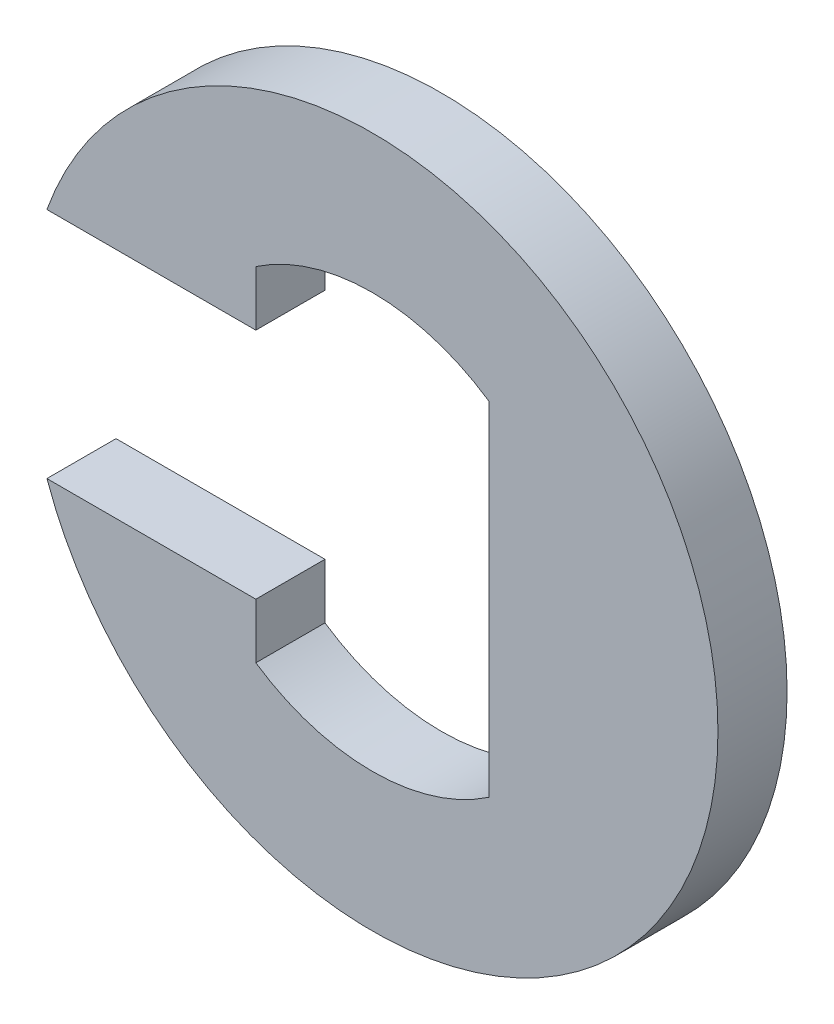
ISO-10303-21;
HEADER;
FILE_DESCRIPTION(('STEP AP214'),'2;1');
FILE_NAME('part.step','',(''),(''),'','','');
FILE_SCHEMA(('AUTOMOTIVE_DESIGN { 1 0 10303 214 1 1 1 1 }'));
ENDSEC;
DATA;
#1=APPLICATION_CONTEXT('core data for automotive mechanical design processes');
#2=APPLICATION_PROTOCOL_DEFINITION('international standard','automotive_design',2000,#1);
#3=PRODUCT_CONTEXT('',#1,'mechanical');
#4=PRODUCT('Part','Part','',(#3));
#5=PRODUCT_RELATED_PRODUCT_CATEGORY('part','',(#4));
#6=PRODUCT_DEFINITION_FORMATION('','',#4);
#7=PRODUCT_DEFINITION_CONTEXT('part definition',#1,'design');
#8=PRODUCT_DEFINITION('design','',#6,#7);
#9=PRODUCT_DEFINITION_SHAPE('','',#8);
#10=(LENGTH_UNIT() NAMED_UNIT(*) SI_UNIT(.MILLI.,.METRE.));
#11=(NAMED_UNIT(*) PLANE_ANGLE_UNIT() SI_UNIT($,.RADIAN.));
#12=(NAMED_UNIT(*) SI_UNIT($,.STERADIAN.) SOLID_ANGLE_UNIT());
#13=UNCERTAINTY_MEASURE_WITH_UNIT(LENGTH_MEASURE(1.E-05),#10,'distance_accuracy_value','');
#14=(GEOMETRIC_REPRESENTATION_CONTEXT(3) GLOBAL_UNCERTAINTY_ASSIGNED_CONTEXT((#13)) GLOBAL_UNIT_ASSIGNED_CONTEXT((#10,
#11,#12)) REPRESENTATION_CONTEXT('',''));
#15=CARTESIAN_POINT('',(0.,0.,0.));
#16=DIRECTION('',(0.,0.,1.));
#17=DIRECTION('',(1.,0.,0.));
#18=AXIS2_PLACEMENT_3D('',#15,#16,#17);
#19=CARTESIAN_POINT('',(0.,0.,1.));
#20=DIRECTION('',(0.,0.,-1.));
#21=DIRECTION('',(-1.,0.,0.));
#22=AXIS2_PLACEMENT_3D('',#19,#20,#21);
#23=CYLINDRICAL_SURFACE('',#22,10.);
#24=DIRECTION('',(0.,0.,1.));
#25=VECTOR('',#24,1.);
#26=CARTESIAN_POINT('',(-9.41504646828681,-3.37,-1.));
#27=LINE('',#26,#25);
#28=CARTESIAN_POINT('',(-9.41504646828681,-3.37,-1.));
#29=VERTEX_POINT('',#28);
#30=CARTESIAN_POINT('',(-9.41504646828681,-3.37,1.));
#31=VERTEX_POINT('',#30);
#32=EDGE_CURVE('E92',#29,#31,#27,.T.);
#33=ORIENTED_EDGE('',*,*,#32,.F.);
#34=CARTESIAN_POINT('',(0.,0.,-1.));
#35=DIRECTION('',(0.,0.,1.));
#36=DIRECTION('',(1.,0.,0.));
#37=AXIS2_PLACEMENT_3D('',#34,#35,#36);
#38=CIRCLE('',#37,10.);
#39=CARTESIAN_POINT('',(-9.41504646828681,3.37,-1.));
#40=VERTEX_POINT('',#39);
#41=EDGE_CURVE('E42',#29,#40,#38,.T.);
#42=ORIENTED_EDGE('',*,*,#41,.T.);
#43=DIRECTION('',(0.,0.,1.));
#44=VECTOR('',#43,1.);
#45=CARTESIAN_POINT('',(-9.41504646828681,3.37,-1.));
#46=LINE('',#45,#44);
#47=CARTESIAN_POINT('',(-9.41504646828681,3.37,1.));
#48=VERTEX_POINT('',#47);
#49=EDGE_CURVE('E115',#40,#48,#46,.T.);
#50=ORIENTED_EDGE('',*,*,#49,.T.);
#51=CARTESIAN_POINT('',(0.,0.,1.));
#52=DIRECTION('',(0.,0.,1.));
#53=DIRECTION('',(1.,0.,0.));
#54=AXIS2_PLACEMENT_3D('',#51,#52,#53);
#55=CIRCLE('',#54,10.);
#56=EDGE_CURVE('E11',#31,#48,#55,.T.);
#57=ORIENTED_EDGE('',*,*,#56,.F.);
#58=EDGE_LOOP('',(#33,#42,#50,#57));
#59=FACE_BOUND('',#58,.T.);
#60=ADVANCED_FACE('F39',(#59),#23,.T.);
#61=CARTESIAN_POINT('',(0.,0.,1.));
#62=DIRECTION('',(0.,0.,1.));
#63=DIRECTION('',(1.,0.,0.));
#64=AXIS2_PLACEMENT_3D('',#61,#62,#63);
#65=PLANE('',#64);
#66=DIRECTION('',(0.,-1.,0.));
#67=VECTOR('',#66,1.);
#68=CARTESIAN_POINT('',(-3.37,0.,1.));
#69=LINE('',#68,#67);
#70=CARTESIAN_POINT('',(-3.37,-3.37,1.));
#71=VERTEX_POINT('',#70);
#72=CARTESIAN_POINT('',(-3.37,-4.96418170497414,1.));
#73=VERTEX_POINT('',#72);
#74=EDGE_CURVE('E156',#71,#73,#69,.T.);
#75=ORIENTED_EDGE('',*,*,#74,.F.);
#76=DIRECTION('',(-1.,0.,0.));
#77=VECTOR('',#76,1.);
#78=CARTESIAN_POINT('',(0.,-3.37,1.));
#79=LINE('',#78,#77);
#80=EDGE_CURVE('E181',#71,#31,#79,.T.);
#81=ORIENTED_EDGE('',*,*,#80,.T.);
#82=ORIENTED_EDGE('',*,*,#56,.T.);
#83=DIRECTION('',(1.,0.,0.));
#84=VECTOR('',#83,1.);
#85=CARTESIAN_POINT('',(0.,3.37,1.));
#86=LINE('',#85,#84);
#87=CARTESIAN_POINT('',(-3.37,3.37,1.));
#88=VERTEX_POINT('',#87);
#89=EDGE_CURVE('E149',#48,#88,#86,.T.);
#90=ORIENTED_EDGE('',*,*,#89,.T.);
#91=CARTESIAN_POINT('',(-3.37,4.96418170497414,1.));
#92=VERTEX_POINT('',#91);
#93=EDGE_CURVE('E128',#92,#88,#69,.T.);
#94=ORIENTED_EDGE('',*,*,#93,.F.);
#95=CARTESIAN_POINT('',(0.,0.,1.));
#96=DIRECTION('',(0.,0.,1.));
#97=DIRECTION('',(1.,0.,0.));
#98=AXIS2_PLACEMENT_3D('',#95,#96,#97);
#99=CIRCLE('',#98,6.);
#100=CARTESIAN_POINT('',(3.37,4.96418170497414,1.));
#101=VERTEX_POINT('',#100);
#102=EDGE_CURVE('E154',#101,#92,#99,.T.);
#103=ORIENTED_EDGE('',*,*,#102,.F.);
#104=DIRECTION('',(0.,-1.,0.));
#105=VECTOR('',#104,1.);
#106=CARTESIAN_POINT('',(3.37,0.,1.));
#107=LINE('',#106,#105);
#108=CARTESIAN_POINT('',(3.37,-4.96418170497414,1.));
#109=VERTEX_POINT('',#108);
#110=EDGE_CURVE('E192',#101,#109,#107,.T.);
#111=ORIENTED_EDGE('',*,*,#110,.T.);
#112=CARTESIAN_POINT('',(0.,0.,1.));
#113=DIRECTION('',(0.,0.,1.));
#114=DIRECTION('',(1.,0.,0.));
#115=AXIS2_PLACEMENT_3D('',#112,#113,#114);
#116=CIRCLE('',#115,6.);
#117=EDGE_CURVE('E189',#73,#109,#116,.T.);
#118=ORIENTED_EDGE('',*,*,#117,.F.);
#119=EDGE_LOOP('',(#75,#81,#82,#90,#94,#103,#111,#118));
#120=FACE_BOUND('',#119,.T.);
#121=ADVANCED_FACE('F186',(#120),#65,.T.);
#122=CARTESIAN_POINT('',(0.,0.,-1.));
#123=DIRECTION('',(0.,0.,1.));
#124=DIRECTION('',(1.,0.,0.));
#125=AXIS2_PLACEMENT_3D('',#122,#123,#124);
#126=PLANE('',#125);
#127=DIRECTION('',(-1.,0.,0.));
#128=VECTOR('',#127,1.);
#129=CARTESIAN_POINT('',(0.,-3.37,-1.));
#130=LINE('',#129,#128);
#131=CARTESIAN_POINT('',(-3.37,-3.37,-1.));
#132=VERTEX_POINT('',#131);
#133=EDGE_CURVE('E63',#132,#29,#130,.T.);
#134=ORIENTED_EDGE('',*,*,#133,.F.);
#135=DIRECTION('',(0.,-1.,0.));
#136=VECTOR('',#135,1.);
#137=CARTESIAN_POINT('',(-3.37,0.,-1.));
#138=LINE('',#137,#136);
#139=CARTESIAN_POINT('',(-3.37,-4.96418170497414,-1.));
#140=VERTEX_POINT('',#139);
#141=EDGE_CURVE('E139',#132,#140,#138,.T.);
#142=ORIENTED_EDGE('',*,*,#141,.T.);
#143=CARTESIAN_POINT('',(0.,0.,-1.));
#144=DIRECTION('',(0.,0.,1.));
#145=DIRECTION('',(1.,0.,0.));
#146=AXIS2_PLACEMENT_3D('',#143,#144,#145);
#147=CIRCLE('',#146,6.);
#148=CARTESIAN_POINT('',(3.37,-4.96418170497414,-1.));
#149=VERTEX_POINT('',#148);
#150=EDGE_CURVE('E54',#140,#149,#147,.T.);
#151=ORIENTED_EDGE('',*,*,#150,.T.);
#152=DIRECTION('',(0.,-1.,0.));
#153=VECTOR('',#152,1.);
#154=CARTESIAN_POINT('',(3.37,0.,-1.));
#155=LINE('',#154,#153);
#156=CARTESIAN_POINT('',(3.37,4.96418170497414,-1.));
#157=VERTEX_POINT('',#156);
#158=EDGE_CURVE('E141',#157,#149,#155,.T.);
#159=ORIENTED_EDGE('',*,*,#158,.F.);
#160=CARTESIAN_POINT('',(0.,0.,-1.));
#161=DIRECTION('',(0.,0.,1.));
#162=DIRECTION('',(1.,0.,0.));
#163=AXIS2_PLACEMENT_3D('',#160,#161,#162);
#164=CIRCLE('',#163,6.);
#165=CARTESIAN_POINT('',(-3.37,4.96418170497414,-1.));
#166=VERTEX_POINT('',#165);
#167=EDGE_CURVE('E136',#157,#166,#164,.T.);
#168=ORIENTED_EDGE('',*,*,#167,.T.);
#169=CARTESIAN_POINT('',(-3.37,3.37,-1.));
#170=VERTEX_POINT('',#169);
#171=EDGE_CURVE('E121',#166,#170,#138,.T.);
#172=ORIENTED_EDGE('',*,*,#171,.T.);
#173=DIRECTION('',(1.,0.,0.));
#174=VECTOR('',#173,1.);
#175=CARTESIAN_POINT('',(0.,3.37,-1.));
#176=LINE('',#175,#174);
#177=EDGE_CURVE('E109',#40,#170,#176,.T.);
#178=ORIENTED_EDGE('',*,*,#177,.F.);
#179=ORIENTED_EDGE('',*,*,#41,.F.);
#180=EDGE_LOOP('',(#134,#142,#151,#159,#168,#172,#178,#179));
#181=FACE_BOUND('',#180,.T.);
#182=ADVANCED_FACE('F133',(#181),#126,.F.);
#183=CARTESIAN_POINT('',(0.,-3.37,-1.));
#184=DIRECTION('',(0.,1.,0.));
#185=DIRECTION('',(-1.,0.,0.));
#186=AXIS2_PLACEMENT_3D('',#183,#184,#185);
#187=PLANE('',#186);
#188=ORIENTED_EDGE('',*,*,#80,.F.);
#189=DIRECTION('',(0.,0.,1.));
#190=VECTOR('',#189,1.);
#191=CARTESIAN_POINT('',(-3.37,-3.37,-1.));
#192=LINE('',#191,#190);
#193=EDGE_CURVE('E96',#132,#71,#192,.T.);
#194=ORIENTED_EDGE('',*,*,#193,.F.);
#195=ORIENTED_EDGE('',*,*,#133,.T.);
#196=ORIENTED_EDGE('',*,*,#32,.T.);
#197=EDGE_LOOP('',(#188,#194,#195,#196));
#198=FACE_BOUND('',#197,.T.);
#199=ADVANCED_FACE('F182',(#198),#187,.T.);
#200=CARTESIAN_POINT('',(0.,3.37,-1.));
#201=DIRECTION('',(0.,-1.,0.));
#202=DIRECTION('',(1.,0.,0.));
#203=AXIS2_PLACEMENT_3D('',#200,#201,#202);
#204=PLANE('',#203);
#205=ORIENTED_EDGE('',*,*,#89,.F.);
#206=ORIENTED_EDGE('',*,*,#49,.F.);
#207=ORIENTED_EDGE('',*,*,#177,.T.);
#208=DIRECTION('',(0.,0.,1.));
#209=VECTOR('',#208,1.);
#210=CARTESIAN_POINT('',(-3.37,3.37,-1.));
#211=LINE('',#210,#209);
#212=EDGE_CURVE('E112',#170,#88,#211,.T.);
#213=ORIENTED_EDGE('',*,*,#212,.T.);
#214=EDGE_LOOP('',(#205,#206,#207,#213));
#215=FACE_BOUND('',#214,.T.);
#216=ADVANCED_FACE('F111',(#215),#204,.T.);
#217=CARTESIAN_POINT('',(-3.37,0.,-1.));
#218=DIRECTION('',(-1.,0.,0.));
#219=DIRECTION('',(0.,0.,1.));
#220=AXIS2_PLACEMENT_3D('',#217,#218,#219);
#221=PLANE('',#220);
#222=ORIENTED_EDGE('',*,*,#93,.T.);
#223=ORIENTED_EDGE('',*,*,#212,.F.);
#224=ORIENTED_EDGE('',*,*,#171,.F.);
#225=DIRECTION('',(0.,0.,1.));
#226=VECTOR('',#225,1.);
#227=CARTESIAN_POINT('',(-3.37,4.96418170497414,-1.));
#228=LINE('',#227,#226);
#229=EDGE_CURVE('E131',#166,#92,#228,.T.);
#230=ORIENTED_EDGE('',*,*,#229,.T.);
#231=EDGE_LOOP('',(#222,#223,#224,#230));
#232=FACE_BOUND('',#231,.T.);
#233=ADVANCED_FACE('F125',(#232),#221,.F.);
#234=CARTESIAN_POINT('',(0.,0.,-1.));
#235=DIRECTION('',(0.,0.,1.));
#236=DIRECTION('',(1.,0.,0.));
#237=AXIS2_PLACEMENT_3D('',#234,#235,#236);
#238=CYLINDRICAL_SURFACE('',#237,6.);
#239=ORIENTED_EDGE('',*,*,#102,.T.);
#240=ORIENTED_EDGE('',*,*,#229,.F.);
#241=ORIENTED_EDGE('',*,*,#167,.F.);
#242=DIRECTION('',(0.,0.,1.));
#243=VECTOR('',#242,1.);
#244=CARTESIAN_POINT('',(3.37,4.96418170497414,-1.));
#245=LINE('',#244,#243);
#246=EDGE_CURVE('E166',#157,#101,#245,.T.);
#247=ORIENTED_EDGE('',*,*,#246,.T.);
#248=EDGE_LOOP('',(#239,#240,#241,#247));
#249=FACE_BOUND('',#248,.T.);
#250=ADVANCED_FACE('F200',(#249),#238,.F.);
#251=CARTESIAN_POINT('',(3.37,0.,-1.));
#252=DIRECTION('',(-1.,0.,0.));
#253=DIRECTION('',(0.,0.,1.));
#254=AXIS2_PLACEMENT_3D('',#251,#252,#253);
#255=PLANE('',#254);
#256=ORIENTED_EDGE('',*,*,#110,.F.);
#257=ORIENTED_EDGE('',*,*,#246,.F.);
#258=ORIENTED_EDGE('',*,*,#158,.T.);
#259=DIRECTION('',(0.,0.,1.));
#260=VECTOR('',#259,1.);
#261=CARTESIAN_POINT('',(3.37,-4.96418170497414,-1.));
#262=LINE('',#261,#260);
#263=EDGE_CURVE('E169',#149,#109,#262,.T.);
#264=ORIENTED_EDGE('',*,*,#263,.T.);
#265=EDGE_LOOP('',(#256,#257,#258,#264));
#266=FACE_BOUND('',#265,.T.);
#267=ADVANCED_FACE('F202',(#266),#255,.T.);
#268=CARTESIAN_POINT('',(0.,0.,-1.));
#269=DIRECTION('',(0.,0.,1.));
#270=DIRECTION('',(1.,0.,0.));
#271=AXIS2_PLACEMENT_3D('',#268,#269,#270);
#272=CYLINDRICAL_SURFACE('',#271,6.);
#273=ORIENTED_EDGE('',*,*,#117,.T.);
#274=ORIENTED_EDGE('',*,*,#263,.F.);
#275=ORIENTED_EDGE('',*,*,#150,.F.);
#276=DIRECTION('',(0.,0.,1.));
#277=VECTOR('',#276,1.);
#278=CARTESIAN_POINT('',(-3.37,-4.96418170497414,-1.));
#279=LINE('',#278,#277);
#280=EDGE_CURVE('E172',#140,#73,#279,.T.);
#281=ORIENTED_EDGE('',*,*,#280,.T.);
#282=EDGE_LOOP('',(#273,#274,#275,#281));
#283=FACE_BOUND('',#282,.T.);
#284=ADVANCED_FACE('F203',(#283),#272,.F.);
#285=ORIENTED_EDGE('',*,*,#74,.T.);
#286=ORIENTED_EDGE('',*,*,#280,.F.);
#287=ORIENTED_EDGE('',*,*,#141,.F.);
#288=ORIENTED_EDGE('',*,*,#193,.T.);
#289=EDGE_LOOP('',(#285,#286,#287,#288));
#290=FACE_BOUND('',#289,.T.);
#291=ADVANCED_FACE('F178',(#290),#221,.F.);
#292=CLOSED_SHELL('',(#60,#121,#182,#199,#216,#233,#250,#267,#284,#291));
#293=MANIFOLD_SOLID_BREP('B2',#292);
#294=ADVANCED_BREP_SHAPE_REPRESENTATION('',(#18,#293),#14);
#295=SHAPE_DEFINITION_REPRESENTATION(#9,#294);
ENDSEC;
END-ISO-10303-21;
